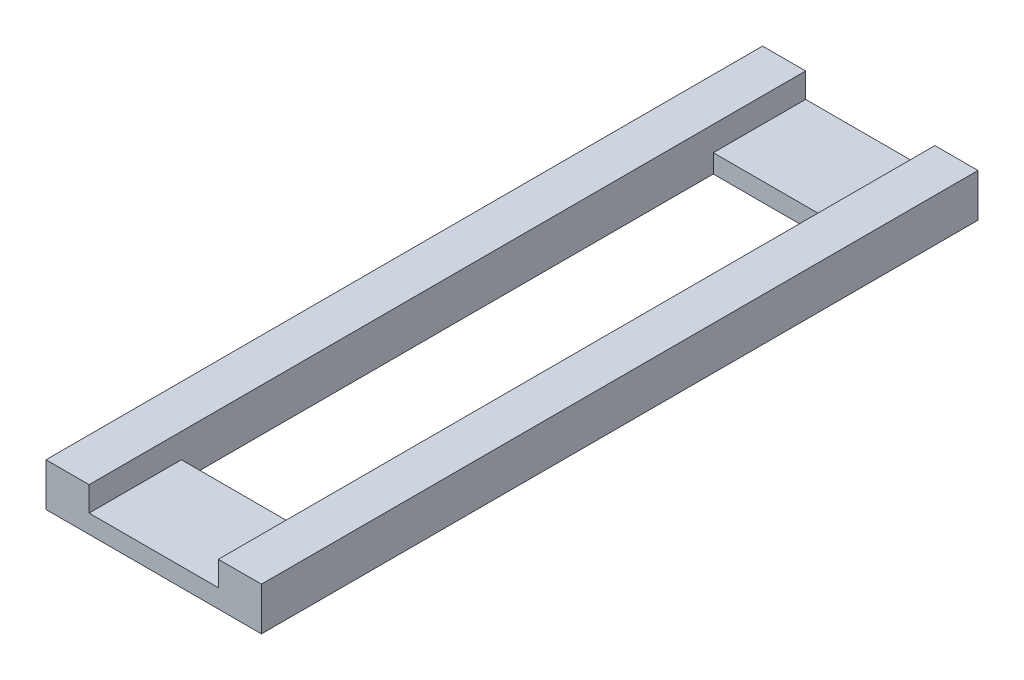
ISO-10303-21;
HEADER;
FILE_DESCRIPTION(('STEP AP214'),'2;1');
FILE_NAME('part.step','',(''),(''),'','','');
FILE_SCHEMA(('AUTOMOTIVE_DESIGN { 1 0 10303 214 1 1 1 1 }'));
ENDSEC;
DATA;
#1=APPLICATION_CONTEXT('core data for automotive mechanical design processes');
#2=APPLICATION_PROTOCOL_DEFINITION('international standard','automotive_design',2000,#1);
#3=PRODUCT_CONTEXT('',#1,'mechanical');
#4=PRODUCT('Part','Part','',(#3));
#5=PRODUCT_RELATED_PRODUCT_CATEGORY('part','',(#4));
#6=PRODUCT_DEFINITION_FORMATION('','',#4);
#7=PRODUCT_DEFINITION_CONTEXT('part definition',#1,'design');
#8=PRODUCT_DEFINITION('design','',#6,#7);
#9=PRODUCT_DEFINITION_SHAPE('','',#8);
#10=(LENGTH_UNIT() NAMED_UNIT(*) SI_UNIT(.MILLI.,.METRE.));
#11=(NAMED_UNIT(*) PLANE_ANGLE_UNIT() SI_UNIT($,.RADIAN.));
#12=(NAMED_UNIT(*) SI_UNIT($,.STERADIAN.) SOLID_ANGLE_UNIT());
#13=UNCERTAINTY_MEASURE_WITH_UNIT(LENGTH_MEASURE(1.E-05),#10,'distance_accuracy_value','');
#14=(GEOMETRIC_REPRESENTATION_CONTEXT(3) GLOBAL_UNCERTAINTY_ASSIGNED_CONTEXT((#13)) GLOBAL_UNIT_ASSIGNED_CONTEXT((#10,
#11,#12)) REPRESENTATION_CONTEXT('',''));
#15=CARTESIAN_POINT('',(0.,0.,0.));
#16=DIRECTION('',(0.,0.,1.));
#17=DIRECTION('',(1.,0.,0.));
#18=AXIS2_PLACEMENT_3D('',#15,#16,#17);
#19=CARTESIAN_POINT('',(0.,15.,0.));
#20=DIRECTION('',(0.,1.,0.));
#21=DIRECTION('',(0.,0.,1.));
#22=AXIS2_PLACEMENT_3D('',#19,#20,#21);
#23=PLANE('',#22);
#24=DIRECTION('',(-1.,0.,0.));
#25=VECTOR('',#24,1.);
#26=CARTESIAN_POINT('',(52.5,15.,-216.));
#27=LINE('',#26,#25);
#28=CARTESIAN_POINT('',(52.5,15.,-216.));
#29=VERTEX_POINT('',#28);
#30=CARTESIAN_POINT('',(-52.5,15.,-216.));
#31=VERTEX_POINT('',#30);
#32=EDGE_CURVE('E140',#29,#31,#27,.T.);
#33=ORIENTED_EDGE('',*,*,#32,.F.);
#34=DIRECTION('',(0.,0.,-1.));
#35=VECTOR('',#34,1.);
#36=CARTESIAN_POINT('',(52.5,15.,291.));
#37=LINE('',#36,#35);
#38=CARTESIAN_POINT('',(52.5,15.,-291.));
#39=VERTEX_POINT('',#38);
#40=EDGE_CURVE('E161',#29,#39,#37,.T.);
#41=ORIENTED_EDGE('',*,*,#40,.T.);
#42=DIRECTION('',(-1.,0.,0.));
#43=VECTOR('',#42,1.);
#44=CARTESIAN_POINT('',(52.5,15.,-291.));
#45=LINE('',#44,#43);
#46=CARTESIAN_POINT('',(-52.5,15.,-291.));
#47=VERTEX_POINT('',#46);
#48=EDGE_CURVE('E165',#39,#47,#45,.T.);
#49=ORIENTED_EDGE('',*,*,#48,.T.);
#50=DIRECTION('',(0.,0.,1.));
#51=VECTOR('',#50,1.);
#52=CARTESIAN_POINT('',(-52.5,15.,291.));
#53=LINE('',#52,#51);
#54=EDGE_CURVE('E155',#47,#31,#53,.T.);
#55=ORIENTED_EDGE('',*,*,#54,.T.);
#56=EDGE_LOOP('',(#33,#41,#49,#55));
#57=FACE_BOUND('',#56,.T.);
#58=ADVANCED_FACE('F33',(#57),#23,.T.);
#59=CARTESIAN_POINT('',(0.,35.,0.));
#60=DIRECTION('',(0.,-1.,0.));
#61=DIRECTION('',(0.,0.,-1.));
#62=AXIS2_PLACEMENT_3D('',#59,#60,#61);
#63=PLANE('',#62);
#64=DIRECTION('',(1.,0.,0.));
#65=VECTOR('',#64,1.);
#66=CARTESIAN_POINT('',(-87.5,35.,291.));
#67=LINE('',#66,#65);
#68=CARTESIAN_POINT('',(-87.5,35.,291.));
#69=VERTEX_POINT('',#68);
#70=CARTESIAN_POINT('',(-52.5,35.,291.));
#71=VERTEX_POINT('',#70);
#72=EDGE_CURVE('E193',#69,#71,#67,.T.);
#73=ORIENTED_EDGE('',*,*,#72,.T.);
#74=DIRECTION('',(0.,0.,1.));
#75=VECTOR('',#74,1.);
#76=CARTESIAN_POINT('',(-52.5,35.,291.));
#77=LINE('',#76,#75);
#78=CARTESIAN_POINT('',(-52.5,35.,-291.));
#79=VERTEX_POINT('',#78);
#80=EDGE_CURVE('E151',#79,#71,#77,.T.);
#81=ORIENTED_EDGE('',*,*,#80,.F.);
#82=DIRECTION('',(-1.,0.,0.));
#83=VECTOR('',#82,1.);
#84=CARTESIAN_POINT('',(-87.5,35.,-291.));
#85=LINE('',#84,#83);
#86=CARTESIAN_POINT('',(-87.5,35.,-291.));
#87=VERTEX_POINT('',#86);
#88=EDGE_CURVE('E185',#79,#87,#85,.T.);
#89=ORIENTED_EDGE('',*,*,#88,.T.);
#90=DIRECTION('',(0.,0.,1.));
#91=VECTOR('',#90,1.);
#92=CARTESIAN_POINT('',(-87.5,35.,291.));
#93=LINE('',#92,#91);
#94=EDGE_CURVE('E190',#87,#69,#93,.T.);
#95=ORIENTED_EDGE('',*,*,#94,.T.);
#96=EDGE_LOOP('',(#73,#81,#89,#95));
#97=FACE_BOUND('',#96,.T.);
#98=ADVANCED_FACE('F238',(#97),#63,.F.);
#99=CARTESIAN_POINT('',(87.5,35.,291.));
#100=DIRECTION('',(-1.,0.,0.));
#101=DIRECTION('',(0.,0.,1.));
#102=AXIS2_PLACEMENT_3D('',#99,#100,#101);
#103=PLANE('',#102);
#104=DIRECTION('',(0.,0.,-1.));
#105=VECTOR('',#104,1.);
#106=CARTESIAN_POINT('',(87.5,0.,291.));
#107=LINE('',#106,#105);
#108=CARTESIAN_POINT('',(87.5,0.,291.));
#109=VERTEX_POINT('',#108);
#110=CARTESIAN_POINT('',(87.5,0.,-291.));
#111=VERTEX_POINT('',#110);
#112=EDGE_CURVE('E174',#109,#111,#107,.T.);
#113=ORIENTED_EDGE('',*,*,#112,.T.);
#114=DIRECTION('',(0.,-1.,0.));
#115=VECTOR('',#114,1.);
#116=CARTESIAN_POINT('',(87.5,35.,-291.));
#117=LINE('',#116,#115);
#118=CARTESIAN_POINT('',(87.5,35.,-291.));
#119=VERTEX_POINT('',#118);
#120=EDGE_CURVE('E11',#119,#111,#117,.T.);
#121=ORIENTED_EDGE('',*,*,#120,.F.);
#122=DIRECTION('',(0.,0.,-1.));
#123=VECTOR('',#122,1.);
#124=CARTESIAN_POINT('',(87.5,35.,291.));
#125=LINE('',#124,#123);
#126=CARTESIAN_POINT('',(87.5,35.,291.));
#127=VERTEX_POINT('',#126);
#128=EDGE_CURVE('E182',#127,#119,#125,.T.);
#129=ORIENTED_EDGE('',*,*,#128,.F.);
#130=DIRECTION('',(0.,-1.,0.));
#131=VECTOR('',#130,1.);
#132=CARTESIAN_POINT('',(87.5,35.,291.));
#133=LINE('',#132,#131);
#134=EDGE_CURVE('E196',#127,#109,#133,.T.);
#135=ORIENTED_EDGE('',*,*,#134,.T.);
#136=EDGE_LOOP('',(#113,#121,#129,#135));
#137=FACE_BOUND('',#136,.T.);
#138=ADVANCED_FACE('F35',(#137),#103,.F.);
#139=CARTESIAN_POINT('',(-87.5,35.,-291.));
#140=DIRECTION('',(0.,0.,1.));
#141=DIRECTION('',(1.,0.,0.));
#142=AXIS2_PLACEMENT_3D('',#139,#140,#141);
#143=PLANE('',#142);
#144=ORIENTED_EDGE('',*,*,#88,.F.);
#145=DIRECTION('',(0.,1.,0.));
#146=VECTOR('',#145,1.);
#147=CARTESIAN_POINT('',(-52.5,15.,-291.));
#148=LINE('',#147,#146);
#149=EDGE_CURVE('E172',#47,#79,#148,.T.);
#150=ORIENTED_EDGE('',*,*,#149,.F.);
#151=ORIENTED_EDGE('',*,*,#48,.F.);
#152=DIRECTION('',(0.,1.,0.));
#153=VECTOR('',#152,1.);
#154=CARTESIAN_POINT('',(52.5,15.,-291.));
#155=LINE('',#154,#153);
#156=CARTESIAN_POINT('',(52.5,35.,-291.));
#157=VERTEX_POINT('',#156);
#158=EDGE_CURVE('E175',#39,#157,#155,.T.);
#159=ORIENTED_EDGE('',*,*,#158,.T.);
#160=EDGE_CURVE('E187',#119,#157,#85,.T.);
#161=ORIENTED_EDGE('',*,*,#160,.F.);
#162=ORIENTED_EDGE('',*,*,#120,.T.);
#163=DIRECTION('',(-1.,0.,0.));
#164=VECTOR('',#163,1.);
#165=CARTESIAN_POINT('',(-87.5,0.,-291.));
#166=LINE('',#165,#164);
#167=CARTESIAN_POINT('',(-87.5,0.,-291.));
#168=VERTEX_POINT('',#167);
#169=EDGE_CURVE('E199',#111,#168,#166,.T.);
#170=ORIENTED_EDGE('',*,*,#169,.T.);
#171=DIRECTION('',(0.,-1.,0.));
#172=VECTOR('',#171,1.);
#173=CARTESIAN_POINT('',(-87.5,35.,-291.));
#174=LINE('',#173,#172);
#175=EDGE_CURVE('E41',#87,#168,#174,.T.);
#176=ORIENTED_EDGE('',*,*,#175,.F.);
#177=EDGE_LOOP('',(#144,#150,#151,#159,#161,#162,#170,#176));
#178=FACE_BOUND('',#177,.T.);
#179=ADVANCED_FACE('F240',(#178),#143,.F.);
#180=CARTESIAN_POINT('',(-87.5,35.,291.));
#181=DIRECTION('',(1.,0.,0.));
#182=DIRECTION('',(0.,0.,-1.));
#183=AXIS2_PLACEMENT_3D('',#180,#181,#182);
#184=PLANE('',#183);
#185=DIRECTION('',(0.,0.,1.));
#186=VECTOR('',#185,1.);
#187=CARTESIAN_POINT('',(-87.5,0.,291.));
#188=LINE('',#187,#186);
#189=CARTESIAN_POINT('',(-87.5,0.,291.));
#190=VERTEX_POINT('',#189);
#191=EDGE_CURVE('E201',#168,#190,#188,.T.);
#192=ORIENTED_EDGE('',*,*,#191,.T.);
#193=DIRECTION('',(0.,-1.,0.));
#194=VECTOR('',#193,1.);
#195=CARTESIAN_POINT('',(-87.5,35.,291.));
#196=LINE('',#195,#194);
#197=EDGE_CURVE('E206',#69,#190,#196,.T.);
#198=ORIENTED_EDGE('',*,*,#197,.F.);
#199=ORIENTED_EDGE('',*,*,#94,.F.);
#200=ORIENTED_EDGE('',*,*,#175,.T.);
#201=EDGE_LOOP('',(#192,#198,#199,#200));
#202=FACE_BOUND('',#201,.T.);
#203=ADVANCED_FACE('F213',(#202),#184,.F.);
#204=CARTESIAN_POINT('',(-87.5,35.,291.));
#205=DIRECTION('',(0.,0.,-1.));
#206=DIRECTION('',(-1.,0.,0.));
#207=AXIS2_PLACEMENT_3D('',#204,#205,#206);
#208=PLANE('',#207);
#209=DIRECTION('',(1.,0.,0.));
#210=VECTOR('',#209,1.);
#211=CARTESIAN_POINT('',(52.5,15.,291.));
#212=LINE('',#211,#210);
#213=CARTESIAN_POINT('',(-52.5,15.,291.));
#214=VERTEX_POINT('',#213);
#215=CARTESIAN_POINT('',(52.5,15.,291.));
#216=VERTEX_POINT('',#215);
#217=EDGE_CURVE('E158',#214,#216,#212,.T.);
#218=ORIENTED_EDGE('',*,*,#217,.F.);
#219=DIRECTION('',(0.,1.,0.));
#220=VECTOR('',#219,1.);
#221=CARTESIAN_POINT('',(-52.5,15.,291.));
#222=LINE('',#221,#220);
#223=EDGE_CURVE('E168',#214,#71,#222,.T.);
#224=ORIENTED_EDGE('',*,*,#223,.T.);
#225=ORIENTED_EDGE('',*,*,#72,.F.);
#226=ORIENTED_EDGE('',*,*,#197,.T.);
#227=DIRECTION('',(1.,0.,0.));
#228=VECTOR('',#227,1.);
#229=CARTESIAN_POINT('',(-87.5,0.,291.));
#230=LINE('',#229,#228);
#231=EDGE_CURVE('E186',#190,#109,#230,.T.);
#232=ORIENTED_EDGE('',*,*,#231,.T.);
#233=ORIENTED_EDGE('',*,*,#134,.F.);
#234=CARTESIAN_POINT('',(52.5,35.,291.));
#235=VERTEX_POINT('',#234);
#236=EDGE_CURVE('E192',#235,#127,#67,.T.);
#237=ORIENTED_EDGE('',*,*,#236,.F.);
#238=DIRECTION('',(0.,1.,0.));
#239=VECTOR('',#238,1.);
#240=CARTESIAN_POINT('',(52.5,15.,291.));
#241=LINE('',#240,#239);
#242=EDGE_CURVE('E178',#216,#235,#241,.T.);
#243=ORIENTED_EDGE('',*,*,#242,.F.);
#244=EDGE_LOOP('',(#218,#224,#225,#226,#232,#233,#237,#243));
#245=FACE_BOUND('',#244,.T.);
#246=ADVANCED_FACE('F222',(#245),#208,.F.);
#247=ORIENTED_EDGE('',*,*,#160,.T.);
#248=DIRECTION('',(0.,0.,-1.));
#249=VECTOR('',#248,1.);
#250=CARTESIAN_POINT('',(52.5,35.,291.));
#251=LINE('',#250,#249);
#252=EDGE_CURVE('E170',#235,#157,#251,.T.);
#253=ORIENTED_EDGE('',*,*,#252,.F.);
#254=ORIENTED_EDGE('',*,*,#236,.T.);
#255=ORIENTED_EDGE('',*,*,#128,.T.);
#256=EDGE_LOOP('',(#247,#253,#254,#255));
#257=FACE_BOUND('',#256,.T.);
#258=ADVANCED_FACE('F229',(#257),#63,.F.);
#259=CARTESIAN_POINT('',(0.,0.,0.));
#260=DIRECTION('',(0.,-1.,0.));
#261=DIRECTION('',(0.,0.,-1.));
#262=AXIS2_PLACEMENT_3D('',#259,#260,#261);
#263=PLANE('',#262);
#264=DIRECTION('',(0.,0.,1.));
#265=VECTOR('',#264,1.);
#266=CARTESIAN_POINT('',(-52.5,0.,216.));
#267=LINE('',#266,#265);
#268=CARTESIAN_POINT('',(-52.5,0.,-216.));
#269=VERTEX_POINT('',#268);
#270=CARTESIAN_POINT('',(-52.5,0.,216.));
#271=VERTEX_POINT('',#270);
#272=EDGE_CURVE('E125',#269,#271,#267,.T.);
#273=ORIENTED_EDGE('',*,*,#272,.T.);
#274=DIRECTION('',(1.,0.,0.));
#275=VECTOR('',#274,1.);
#276=CARTESIAN_POINT('',(52.5,0.,216.));
#277=LINE('',#276,#275);
#278=CARTESIAN_POINT('',(52.5,0.,216.));
#279=VERTEX_POINT('',#278);
#280=EDGE_CURVE('E133',#271,#279,#277,.T.);
#281=ORIENTED_EDGE('',*,*,#280,.T.);
#282=DIRECTION('',(0.,0.,-1.));
#283=VECTOR('',#282,1.);
#284=CARTESIAN_POINT('',(52.5,0.,216.));
#285=LINE('',#284,#283);
#286=CARTESIAN_POINT('',(52.5,0.,-216.));
#287=VERTEX_POINT('',#286);
#288=EDGE_CURVE('E48',#279,#287,#285,.T.);
#289=ORIENTED_EDGE('',*,*,#288,.T.);
#290=DIRECTION('',(-1.,0.,0.));
#291=VECTOR('',#290,1.);
#292=CARTESIAN_POINT('',(52.5,0.,-216.));
#293=LINE('',#292,#291);
#294=EDGE_CURVE('E130',#287,#269,#293,.T.);
#295=ORIENTED_EDGE('',*,*,#294,.T.);
#296=EDGE_LOOP('',(#273,#281,#289,#295));
#297=FACE_BOUND('',#296,.T.);
#298=ORIENTED_EDGE('',*,*,#112,.F.);
#299=ORIENTED_EDGE('',*,*,#231,.F.);
#300=ORIENTED_EDGE('',*,*,#191,.F.);
#301=ORIENTED_EDGE('',*,*,#169,.F.);
#302=EDGE_LOOP('',(#298,#299,#300,#301));
#303=FACE_BOUND('',#302,.T.);
#304=ADVANCED_FACE('F137',(#297,#303),#263,.T.);
#305=CARTESIAN_POINT('',(-52.5,15.,291.));
#306=DIRECTION('',(-1.,0.,0.));
#307=DIRECTION('',(0.,0.,1.));
#308=AXIS2_PLACEMENT_3D('',#305,#306,#307);
#309=PLANE('',#308);
#310=ORIENTED_EDGE('',*,*,#80,.T.);
#311=ORIENTED_EDGE('',*,*,#223,.F.);
#312=CARTESIAN_POINT('',(-52.5,15.,216.));
#313=VERTEX_POINT('',#312);
#314=EDGE_CURVE('E128',#313,#214,#53,.T.);
#315=ORIENTED_EDGE('',*,*,#314,.F.);
#316=DIRECTION('',(0.,1.,0.));
#317=VECTOR('',#316,1.);
#318=CARTESIAN_POINT('',(-52.5,0.,216.));
#319=LINE('',#318,#317);
#320=EDGE_CURVE('E56',#271,#313,#319,.T.);
#321=ORIENTED_EDGE('',*,*,#320,.F.);
#322=ORIENTED_EDGE('',*,*,#272,.F.);
#323=DIRECTION('',(0.,1.,0.));
#324=VECTOR('',#323,1.);
#325=CARTESIAN_POINT('',(-52.5,0.,-216.));
#326=LINE('',#325,#324);
#327=EDGE_CURVE('E149',#269,#31,#326,.T.);
#328=ORIENTED_EDGE('',*,*,#327,.T.);
#329=ORIENTED_EDGE('',*,*,#54,.F.);
#330=ORIENTED_EDGE('',*,*,#149,.T.);
#331=EDGE_LOOP('',(#310,#311,#315,#321,#322,#328,#329,#330));
#332=FACE_BOUND('',#331,.T.);
#333=ADVANCED_FACE('F123',(#332),#309,.F.);
#334=CARTESIAN_POINT('',(52.5,15.,291.));
#335=DIRECTION('',(1.,0.,0.));
#336=DIRECTION('',(0.,0.,-1.));
#337=AXIS2_PLACEMENT_3D('',#334,#335,#336);
#338=PLANE('',#337);
#339=ORIENTED_EDGE('',*,*,#252,.T.);
#340=ORIENTED_EDGE('',*,*,#158,.F.);
#341=ORIENTED_EDGE('',*,*,#40,.F.);
#342=DIRECTION('',(0.,1.,0.));
#343=VECTOR('',#342,1.);
#344=CARTESIAN_POINT('',(52.5,0.,-216.));
#345=LINE('',#344,#343);
#346=EDGE_CURVE('E152',#287,#29,#345,.T.);
#347=ORIENTED_EDGE('',*,*,#346,.F.);
#348=ORIENTED_EDGE('',*,*,#288,.F.);
#349=DIRECTION('',(0.,1.,0.));
#350=VECTOR('',#349,1.);
#351=CARTESIAN_POINT('',(52.5,0.,216.));
#352=LINE('',#351,#350);
#353=CARTESIAN_POINT('',(52.5,15.,216.));
#354=VERTEX_POINT('',#353);
#355=EDGE_CURVE('E129',#279,#354,#352,.T.);
#356=ORIENTED_EDGE('',*,*,#355,.T.);
#357=EDGE_CURVE('E162',#216,#354,#37,.T.);
#358=ORIENTED_EDGE('',*,*,#357,.F.);
#359=ORIENTED_EDGE('',*,*,#242,.T.);
#360=EDGE_LOOP('',(#339,#340,#341,#347,#348,#356,#358,#359));
#361=FACE_BOUND('',#360,.T.);
#362=ADVANCED_FACE('F232',(#361),#338,.F.);
#363=DIRECTION('',(1.,0.,0.));
#364=VECTOR('',#363,1.);
#365=CARTESIAN_POINT('',(52.5,15.,216.));
#366=LINE('',#365,#364);
#367=EDGE_CURVE('E143',#313,#354,#366,.T.);
#368=ORIENTED_EDGE('',*,*,#367,.F.);
#369=ORIENTED_EDGE('',*,*,#314,.T.);
#370=ORIENTED_EDGE('',*,*,#217,.T.);
#371=ORIENTED_EDGE('',*,*,#357,.T.);
#372=EDGE_LOOP('',(#368,#369,#370,#371));
#373=FACE_BOUND('',#372,.T.);
#374=ADVANCED_FACE('F235',(#373),#23,.T.);
#375=CARTESIAN_POINT('',(52.5,0.,-216.));
#376=DIRECTION('',(0.,0.,-1.));
#377=DIRECTION('',(-1.,0.,0.));
#378=AXIS2_PLACEMENT_3D('',#375,#376,#377);
#379=PLANE('',#378);
#380=ORIENTED_EDGE('',*,*,#32,.T.);
#381=ORIENTED_EDGE('',*,*,#327,.F.);
#382=ORIENTED_EDGE('',*,*,#294,.F.);
#383=ORIENTED_EDGE('',*,*,#346,.T.);
#384=EDGE_LOOP('',(#380,#381,#382,#383));
#385=FACE_BOUND('',#384,.T.);
#386=ADVANCED_FACE('F246',(#385),#379,.F.);
#387=CARTESIAN_POINT('',(52.5,0.,216.));
#388=DIRECTION('',(0.,0.,1.));
#389=DIRECTION('',(1.,0.,0.));
#390=AXIS2_PLACEMENT_3D('',#387,#388,#389);
#391=PLANE('',#390);
#392=ORIENTED_EDGE('',*,*,#367,.T.);
#393=ORIENTED_EDGE('',*,*,#355,.F.);
#394=ORIENTED_EDGE('',*,*,#280,.F.);
#395=ORIENTED_EDGE('',*,*,#320,.T.);
#396=EDGE_LOOP('',(#392,#393,#394,#395));
#397=FACE_BOUND('',#396,.T.);
#398=ADVANCED_FACE('F134',(#397),#391,.F.);
#399=CLOSED_SHELL('',(#58,#98,#138,#179,#203,#246,#258,#304,#333,#362,#374,#386,#398));
#400=MANIFOLD_SOLID_BREP('B2',#399);
#401=ADVANCED_BREP_SHAPE_REPRESENTATION('',(#18,#400),#14);
#402=SHAPE_DEFINITION_REPRESENTATION(#9,#401);
ENDSEC;
END-ISO-10303-21;
